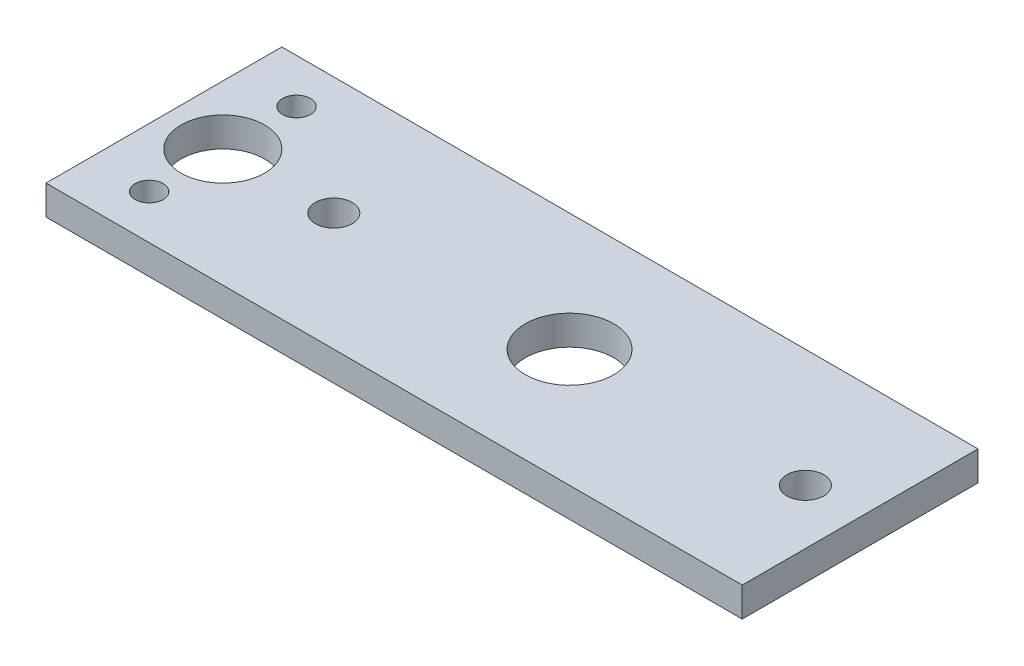
ISO-10303-21;
HEADER;
FILE_DESCRIPTION(('STEP AP214'),'2;1');
FILE_NAME('part.step','',(''),(''),'','','');
FILE_SCHEMA(('AUTOMOTIVE_DESIGN { 1 0 10303 214 1 1 1 1 }'));
ENDSEC;
DATA;
#1=APPLICATION_CONTEXT('core data for automotive mechanical design processes');
#2=APPLICATION_PROTOCOL_DEFINITION('international standard','automotive_design',2000,#1);
#3=PRODUCT_CONTEXT('',#1,'mechanical');
#4=PRODUCT('Part','Part','',(#3));
#5=PRODUCT_RELATED_PRODUCT_CATEGORY('part','',(#4));
#6=PRODUCT_DEFINITION_FORMATION('','',#4);
#7=PRODUCT_DEFINITION_CONTEXT('part definition',#1,'design');
#8=PRODUCT_DEFINITION('design','',#6,#7);
#9=PRODUCT_DEFINITION_SHAPE('','',#8);
#10=(LENGTH_UNIT() NAMED_UNIT(*) SI_UNIT(.MILLI.,.METRE.));
#11=(NAMED_UNIT(*) PLANE_ANGLE_UNIT() SI_UNIT($,.RADIAN.));
#12=(NAMED_UNIT(*) SI_UNIT($,.STERADIAN.) SOLID_ANGLE_UNIT());
#13=UNCERTAINTY_MEASURE_WITH_UNIT(LENGTH_MEASURE(1.E-05),#10,'distance_accuracy_value','');
#14=(GEOMETRIC_REPRESENTATION_CONTEXT(3) GLOBAL_UNCERTAINTY_ASSIGNED_CONTEXT((#13)) GLOBAL_UNIT_ASSIGNED_CONTEXT((#10,
#11,#12)) REPRESENTATION_CONTEXT('',''));
#15=CARTESIAN_POINT('',(0.,0.,0.));
#16=DIRECTION('',(0.,0.,1.));
#17=DIRECTION('',(1.,0.,0.));
#18=AXIS2_PLACEMENT_3D('',#15,#16,#17);
#19=CARTESIAN_POINT('',(0.,3.175,-25.4));
#20=DIRECTION('',(0.,0.,-1.));
#21=DIRECTION('',(-1.,0.,0.));
#22=AXIS2_PLACEMENT_3D('',#19,#20,#21);
#23=PLANE('',#22);
#24=DIRECTION('',(1.,0.,0.));
#25=VECTOR('',#24,1.);
#26=CARTESIAN_POINT('',(0.,0.,-25.4));
#27=LINE('',#26,#25);
#28=CARTESIAN_POINT('',(0.,0.,-25.4));
#29=VERTEX_POINT('',#28);
#30=CARTESIAN_POINT('',(75.,0.,-25.4));
#31=VERTEX_POINT('',#30);
#32=EDGE_CURVE('E116',#29,#31,#27,.T.);
#33=ORIENTED_EDGE('',*,*,#32,.F.);
#34=DIRECTION('',(0.,-1.,0.));
#35=VECTOR('',#34,1.);
#36=CARTESIAN_POINT('',(0.,3.175,-25.4));
#37=LINE('',#36,#35);
#38=CARTESIAN_POINT('',(0.,3.175,-25.4));
#39=VERTEX_POINT('',#38);
#40=EDGE_CURVE('E11',#39,#29,#37,.T.);
#41=ORIENTED_EDGE('',*,*,#40,.F.);
#42=DIRECTION('',(1.,0.,0.));
#43=VECTOR('',#42,1.);
#44=CARTESIAN_POINT('',(0.,3.175,-25.4));
#45=LINE('',#44,#43);
#46=CARTESIAN_POINT('',(75.,3.175,-25.4));
#47=VERTEX_POINT('',#46);
#48=EDGE_CURVE('E97',#39,#47,#45,.T.);
#49=ORIENTED_EDGE('',*,*,#48,.T.);
#50=DIRECTION('',(0.,-1.,0.));
#51=VECTOR('',#50,1.);
#52=CARTESIAN_POINT('',(75.,3.175,-25.4));
#53=LINE('',#52,#51);
#54=EDGE_CURVE('E75',#47,#31,#53,.T.);
#55=ORIENTED_EDGE('',*,*,#54,.T.);
#56=EDGE_LOOP('',(#33,#41,#49,#55));
#57=FACE_BOUND('',#56,.T.);
#58=ADVANCED_FACE('F35',(#57),#23,.T.);
#59=CARTESIAN_POINT('',(0.,3.175,0.));
#60=DIRECTION('',(-1.,0.,0.));
#61=DIRECTION('',(0.,0.,1.));
#62=AXIS2_PLACEMENT_3D('',#59,#60,#61);
#63=PLANE('',#62);
#64=DIRECTION('',(0.,0.,-1.));
#65=VECTOR('',#64,1.);
#66=CARTESIAN_POINT('',(0.,0.,0.));
#67=LINE('',#66,#65);
#68=CARTESIAN_POINT('',(0.,0.,0.));
#69=VERTEX_POINT('',#68);
#70=EDGE_CURVE('E87',#69,#29,#67,.T.);
#71=ORIENTED_EDGE('',*,*,#70,.F.);
#72=DIRECTION('',(0.,-1.,0.));
#73=VECTOR('',#72,1.);
#74=CARTESIAN_POINT('',(0.,3.175,0.));
#75=LINE('',#74,#73);
#76=CARTESIAN_POINT('',(0.,3.175,0.));
#77=VERTEX_POINT('',#76);
#78=EDGE_CURVE('E44',#77,#69,#75,.T.);
#79=ORIENTED_EDGE('',*,*,#78,.F.);
#80=DIRECTION('',(0.,0.,-1.));
#81=VECTOR('',#80,1.);
#82=CARTESIAN_POINT('',(0.,3.175,0.));
#83=LINE('',#82,#81);
#84=EDGE_CURVE('E85',#77,#39,#83,.T.);
#85=ORIENTED_EDGE('',*,*,#84,.T.);
#86=ORIENTED_EDGE('',*,*,#40,.T.);
#87=EDGE_LOOP('',(#71,#79,#85,#86));
#88=FACE_BOUND('',#87,.T.);
#89=ADVANCED_FACE('F83',(#88),#63,.T.);
#90=CARTESIAN_POINT('',(0.,3.175,0.));
#91=DIRECTION('',(0.,0.,-1.));
#92=DIRECTION('',(-1.,0.,0.));
#93=AXIS2_PLACEMENT_3D('',#90,#91,#92);
#94=PLANE('',#93);
#95=DIRECTION('',(1.,0.,0.));
#96=VECTOR('',#95,1.);
#97=CARTESIAN_POINT('',(0.,0.,0.));
#98=LINE('',#97,#96);
#99=CARTESIAN_POINT('',(75.,0.,0.));
#100=VERTEX_POINT('',#99);
#101=EDGE_CURVE('E120',#69,#100,#98,.T.);
#102=ORIENTED_EDGE('',*,*,#101,.T.);
#103=DIRECTION('',(0.,-1.,0.));
#104=VECTOR('',#103,1.);
#105=CARTESIAN_POINT('',(75.,3.175,0.));
#106=LINE('',#105,#104);
#107=CARTESIAN_POINT('',(75.,3.175,0.));
#108=VERTEX_POINT('',#107);
#109=EDGE_CURVE('E90',#108,#100,#106,.T.);
#110=ORIENTED_EDGE('',*,*,#109,.F.);
#111=DIRECTION('',(1.,0.,0.));
#112=VECTOR('',#111,1.);
#113=CARTESIAN_POINT('',(0.,3.175,0.));
#114=LINE('',#113,#112);
#115=EDGE_CURVE('E92',#77,#108,#114,.T.);
#116=ORIENTED_EDGE('',*,*,#115,.F.);
#117=ORIENTED_EDGE('',*,*,#78,.T.);
#118=EDGE_LOOP('',(#102,#110,#116,#117));
#119=FACE_BOUND('',#118,.T.);
#120=ADVANCED_FACE('F93',(#119),#94,.F.);
#121=CARTESIAN_POINT('',(6.35,3.175,-20.6375));
#122=DIRECTION('',(0.,-1.,0.));
#123=DIRECTION('',(0.,0.,-1.));
#124=AXIS2_PLACEMENT_3D('',#121,#122,#123);
#125=CYLINDRICAL_SURFACE('',#124,1.5);
#126=CARTESIAN_POINT('',(6.35,3.175,-20.6375));
#127=DIRECTION('',(0.,1.,0.));
#128=DIRECTION('',(0.,0.,1.));
#129=AXIS2_PLACEMENT_3D('',#126,#127,#128);
#130=CIRCLE('',#129,1.5);
#131=CARTESIAN_POINT('',(6.35,3.175,-19.1375));
#132=VERTEX_POINT('',#131);
#133=EDGE_CURVE('E107',#132,#132,#130,.T.);
#134=ORIENTED_EDGE('',*,*,#133,.T.);
#135=EDGE_LOOP('',(#134));
#136=FACE_BOUND('',#135,.T.);
#137=CARTESIAN_POINT('',(6.35,0.,-20.6375));
#138=DIRECTION('',(0.,1.,0.));
#139=DIRECTION('',(0.,0.,1.));
#140=AXIS2_PLACEMENT_3D('',#137,#138,#139);
#141=CIRCLE('',#140,1.5);
#142=CARTESIAN_POINT('',(6.35,0.,-19.1375));
#143=VERTEX_POINT('',#142);
#144=EDGE_CURVE('E126',#143,#143,#141,.T.);
#145=ORIENTED_EDGE('',*,*,#144,.F.);
#146=EDGE_LOOP('',(#145));
#147=FACE_BOUND('',#146,.T.);
#148=ADVANCED_FACE('F145',(#136,#147),#125,.F.);
#149=CARTESIAN_POINT('',(6.35,3.175,-4.7625));
#150=DIRECTION('',(0.,-1.,0.));
#151=DIRECTION('',(0.,0.,-1.));
#152=AXIS2_PLACEMENT_3D('',#149,#150,#151);
#153=CYLINDRICAL_SURFACE('',#152,1.5);
#154=CARTESIAN_POINT('',(6.35,3.175,-4.7625));
#155=DIRECTION('',(0.,1.,0.));
#156=DIRECTION('',(0.,0.,1.));
#157=AXIS2_PLACEMENT_3D('',#154,#155,#156);
#158=CIRCLE('',#157,1.5);
#159=CARTESIAN_POINT('',(6.35,3.175,-3.2625));
#160=VERTEX_POINT('',#159);
#161=EDGE_CURVE('E104',#160,#160,#158,.T.);
#162=ORIENTED_EDGE('',*,*,#161,.T.);
#163=EDGE_LOOP('',(#162));
#164=FACE_BOUND('',#163,.T.);
#165=CARTESIAN_POINT('',(6.35,0.,-4.7625));
#166=DIRECTION('',(0.,1.,0.));
#167=DIRECTION('',(0.,0.,1.));
#168=AXIS2_PLACEMENT_3D('',#165,#166,#167);
#169=CIRCLE('',#168,1.5);
#170=CARTESIAN_POINT('',(6.35,0.,-3.2625));
#171=VERTEX_POINT('',#170);
#172=EDGE_CURVE('E123',#171,#171,#169,.T.);
#173=ORIENTED_EDGE('',*,*,#172,.F.);
#174=EDGE_LOOP('',(#173));
#175=FACE_BOUND('',#174,.T.);
#176=ADVANCED_FACE('F148',(#164,#175),#153,.F.);
#177=CARTESIAN_POINT('',(75.,3.175,0.));
#178=DIRECTION('',(-1.,0.,0.));
#179=DIRECTION('',(0.,0.,1.));
#180=AXIS2_PLACEMENT_3D('',#177,#178,#179);
#181=PLANE('',#180);
#182=DIRECTION('',(0.,0.,-1.));
#183=VECTOR('',#182,1.);
#184=CARTESIAN_POINT('',(75.,0.,0.));
#185=LINE('',#184,#183);
#186=EDGE_CURVE('E68',#100,#31,#185,.T.);
#187=ORIENTED_EDGE('',*,*,#186,.T.);
#188=ORIENTED_EDGE('',*,*,#54,.F.);
#189=DIRECTION('',(0.,0.,-1.));
#190=VECTOR('',#189,1.);
#191=CARTESIAN_POINT('',(75.,3.175,0.));
#192=LINE('',#191,#190);
#193=EDGE_CURVE('E52',#108,#47,#192,.T.);
#194=ORIENTED_EDGE('',*,*,#193,.F.);
#195=ORIENTED_EDGE('',*,*,#109,.T.);
#196=EDGE_LOOP('',(#187,#188,#194,#195));
#197=FACE_BOUND('',#196,.T.);
#198=ADVANCED_FACE('F134',(#197),#181,.F.);
#199=CARTESIAN_POINT('',(43.7,3.175,-12.7));
#200=DIRECTION('',(0.,-1.,0.));
#201=DIRECTION('',(0.,0.,-1.));
#202=AXIS2_PLACEMENT_3D('',#199,#200,#201);
#203=CYLINDRICAL_SURFACE('',#202,4.7625);
#204=CARTESIAN_POINT('',(43.7,3.175,-12.7));
#205=DIRECTION('',(0.,1.,0.));
#206=DIRECTION('',(0.,0.,1.));
#207=AXIS2_PLACEMENT_3D('',#204,#205,#206);
#208=CIRCLE('',#207,4.7625);
#209=CARTESIAN_POINT('',(43.7,3.175,-7.93749999999999));
#210=VERTEX_POINT('',#209);
#211=EDGE_CURVE('E99',#210,#210,#208,.T.);
#212=ORIENTED_EDGE('',*,*,#211,.T.);
#213=EDGE_LOOP('',(#212));
#214=FACE_BOUND('',#213,.T.);
#215=CARTESIAN_POINT('',(43.7,0.,-12.7));
#216=DIRECTION('',(0.,1.,0.));
#217=DIRECTION('',(0.,0.,1.));
#218=AXIS2_PLACEMENT_3D('',#215,#216,#217);
#219=CIRCLE('',#218,4.7625);
#220=CARTESIAN_POINT('',(43.7,0.,-7.93749999999999));
#221=VERTEX_POINT('',#220);
#222=EDGE_CURVE('E113',#221,#221,#219,.T.);
#223=ORIENTED_EDGE('',*,*,#222,.F.);
#224=EDGE_LOOP('',(#223));
#225=FACE_BOUND('',#224,.T.);
#226=ADVANCED_FACE('F37',(#214,#225),#203,.F.);
#227=CARTESIAN_POINT('',(6.35,3.175,-12.7));
#228=DIRECTION('',(0.,-1.,0.));
#229=DIRECTION('',(0.,0.,-1.));
#230=AXIS2_PLACEMENT_3D('',#227,#228,#229);
#231=CYLINDRICAL_SURFACE('',#230,4.5);
#232=CARTESIAN_POINT('',(6.35,3.175,-12.7));
#233=DIRECTION('',(0.,1.,0.));
#234=DIRECTION('',(0.,0.,1.));
#235=AXIS2_PLACEMENT_3D('',#232,#233,#234);
#236=CIRCLE('',#235,4.5);
#237=CARTESIAN_POINT('',(6.35,3.175,-8.2));
#238=VERTEX_POINT('',#237);
#239=EDGE_CURVE('E110',#238,#238,#236,.T.);
#240=ORIENTED_EDGE('',*,*,#239,.T.);
#241=EDGE_LOOP('',(#240));
#242=FACE_BOUND('',#241,.T.);
#243=CARTESIAN_POINT('',(6.35,0.,-12.7));
#244=DIRECTION('',(0.,1.,0.));
#245=DIRECTION('',(0.,0.,1.));
#246=AXIS2_PLACEMENT_3D('',#243,#244,#245);
#247=CIRCLE('',#246,4.5);
#248=CARTESIAN_POINT('',(6.35,0.,-8.2));
#249=VERTEX_POINT('',#248);
#250=EDGE_CURVE('E129',#249,#249,#247,.T.);
#251=ORIENTED_EDGE('',*,*,#250,.F.);
#252=EDGE_LOOP('',(#251));
#253=FACE_BOUND('',#252,.T.);
#254=ADVANCED_FACE('F155',(#242,#253),#231,.F.);
#255=CARTESIAN_POINT('',(0.,3.175,0.));
#256=DIRECTION('',(0.,1.,0.));
#257=DIRECTION('',(0.,0.,1.));
#258=AXIS2_PLACEMENT_3D('',#255,#256,#257);
#259=PLANE('',#258);
#260=CARTESIAN_POINT('',(69.1,3.175,-12.7));
#261=DIRECTION('',(0.,-1.,0.));
#262=DIRECTION('',(0.,0.,-1.));
#263=AXIS2_PLACEMENT_3D('',#260,#261,#262);
#264=CIRCLE('',#263,1.984375);
#265=CARTESIAN_POINT('',(69.1,3.175,-14.684375));
#266=VERTEX_POINT('',#265);
#267=EDGE_CURVE('E117',#266,#266,#264,.T.);
#268=ORIENTED_EDGE('',*,*,#267,.T.);
#269=EDGE_LOOP('',(#268));
#270=FACE_BOUND('',#269,.T.);
#271=CARTESIAN_POINT('',(18.3,3.175,-12.7));
#272=DIRECTION('',(0.,-1.,0.));
#273=DIRECTION('',(0.,0.,-1.));
#274=AXIS2_PLACEMENT_3D('',#271,#272,#273);
#275=CIRCLE('',#274,1.984375);
#276=CARTESIAN_POINT('',(18.3,3.175,-14.684375));
#277=VERTEX_POINT('',#276);
#278=EDGE_CURVE('E180',#277,#277,#275,.T.);
#279=ORIENTED_EDGE('',*,*,#278,.T.);
#280=EDGE_LOOP('',(#279));
#281=FACE_BOUND('',#280,.T.);
#282=ORIENTED_EDGE('',*,*,#211,.F.);
#283=EDGE_LOOP('',(#282));
#284=FACE_BOUND('',#283,.T.);
#285=ORIENTED_EDGE('',*,*,#48,.F.);
#286=ORIENTED_EDGE('',*,*,#84,.F.);
#287=ORIENTED_EDGE('',*,*,#115,.T.);
#288=ORIENTED_EDGE('',*,*,#193,.T.);
#289=EDGE_LOOP('',(#285,#286,#287,#288));
#290=FACE_BOUND('',#289,.T.);
#291=ORIENTED_EDGE('',*,*,#161,.F.);
#292=EDGE_LOOP('',(#291));
#293=FACE_BOUND('',#292,.T.);
#294=ORIENTED_EDGE('',*,*,#133,.F.);
#295=EDGE_LOOP('',(#294));
#296=FACE_BOUND('',#295,.T.);
#297=ORIENTED_EDGE('',*,*,#239,.F.);
#298=EDGE_LOOP('',(#297));
#299=FACE_BOUND('',#298,.T.);
#300=ADVANCED_FACE('F95',(#270,#281,#284,#290,#293,#296,#299),#259,.T.);
#301=CARTESIAN_POINT('',(0.,0.,0.));
#302=DIRECTION('',(0.,1.,0.));
#303=DIRECTION('',(0.,0.,1.));
#304=AXIS2_PLACEMENT_3D('',#301,#302,#303);
#305=PLANE('',#304);
#306=CARTESIAN_POINT('',(69.1,0.,-12.7));
#307=DIRECTION('',(0.,-1.,0.));
#308=DIRECTION('',(0.,0.,-1.));
#309=AXIS2_PLACEMENT_3D('',#306,#307,#308);
#310=CIRCLE('',#309,1.984375);
#311=CARTESIAN_POINT('',(69.1,0.,-14.684375));
#312=VERTEX_POINT('',#311);
#313=EDGE_CURVE('E179',#312,#312,#310,.T.);
#314=ORIENTED_EDGE('',*,*,#313,.F.);
#315=EDGE_LOOP('',(#314));
#316=FACE_BOUND('',#315,.T.);
#317=CARTESIAN_POINT('',(18.3,0.,-12.7));
#318=DIRECTION('',(0.,-1.,0.));
#319=DIRECTION('',(0.,0.,-1.));
#320=AXIS2_PLACEMENT_3D('',#317,#318,#319);
#321=CIRCLE('',#320,1.984375);
#322=CARTESIAN_POINT('',(18.3,0.,-14.684375));
#323=VERTEX_POINT('',#322);
#324=EDGE_CURVE('E184',#323,#323,#321,.T.);
#325=ORIENTED_EDGE('',*,*,#324,.F.);
#326=EDGE_LOOP('',(#325));
#327=FACE_BOUND('',#326,.T.);
#328=ORIENTED_EDGE('',*,*,#222,.T.);
#329=EDGE_LOOP('',(#328));
#330=FACE_BOUND('',#329,.T.);
#331=ORIENTED_EDGE('',*,*,#32,.T.);
#332=ORIENTED_EDGE('',*,*,#186,.F.);
#333=ORIENTED_EDGE('',*,*,#101,.F.);
#334=ORIENTED_EDGE('',*,*,#70,.T.);
#335=EDGE_LOOP('',(#331,#332,#333,#334));
#336=FACE_BOUND('',#335,.T.);
#337=ORIENTED_EDGE('',*,*,#172,.T.);
#338=EDGE_LOOP('',(#337));
#339=FACE_BOUND('',#338,.T.);
#340=ORIENTED_EDGE('',*,*,#144,.T.);
#341=EDGE_LOOP('',(#340));
#342=FACE_BOUND('',#341,.T.);
#343=ORIENTED_EDGE('',*,*,#250,.T.);
#344=EDGE_LOOP('',(#343));
#345=FACE_BOUND('',#344,.T.);
#346=ADVANCED_FACE('F135',(#316,#327,#330,#336,#339,#342,#345),#305,.F.);
#347=CARTESIAN_POINT('',(18.3,3.175,-12.7));
#348=DIRECTION('',(0.,-1.,0.));
#349=DIRECTION('',(0.,0.,-1.));
#350=AXIS2_PLACEMENT_3D('',#347,#348,#349);
#351=CYLINDRICAL_SURFACE('',#350,1.984375);
#352=ORIENTED_EDGE('',*,*,#278,.F.);
#353=EDGE_LOOP('',(#352));
#354=FACE_BOUND('',#353,.T.);
#355=ORIENTED_EDGE('',*,*,#324,.T.);
#356=EDGE_LOOP('',(#355));
#357=FACE_BOUND('',#356,.T.);
#358=ADVANCED_FACE('F161',(#354,#357),#351,.F.);
#359=CARTESIAN_POINT('',(69.1,3.175,-12.7));
#360=DIRECTION('',(0.,-1.,0.));
#361=DIRECTION('',(0.,0.,-1.));
#362=AXIS2_PLACEMENT_3D('',#359,#360,#361);
#363=CYLINDRICAL_SURFACE('',#362,1.984375);
#364=ORIENTED_EDGE('',*,*,#267,.F.);
#365=EDGE_LOOP('',(#364));
#366=FACE_BOUND('',#365,.T.);
#367=ORIENTED_EDGE('',*,*,#313,.T.);
#368=EDGE_LOOP('',(#367));
#369=FACE_BOUND('',#368,.T.);
#370=ADVANCED_FACE('F168',(#366,#369),#363,.F.);
#371=CLOSED_SHELL('',(#58,#89,#120,#148,#176,#198,#226,#254,#300,#346,#358,#370));
#372=MANIFOLD_SOLID_BREP('B2',#371);
#373=ADVANCED_BREP_SHAPE_REPRESENTATION('',(#18,#372),#14);
#374=SHAPE_DEFINITION_REPRESENTATION(#9,#373);
ENDSEC;
END-ISO-10303-21;
